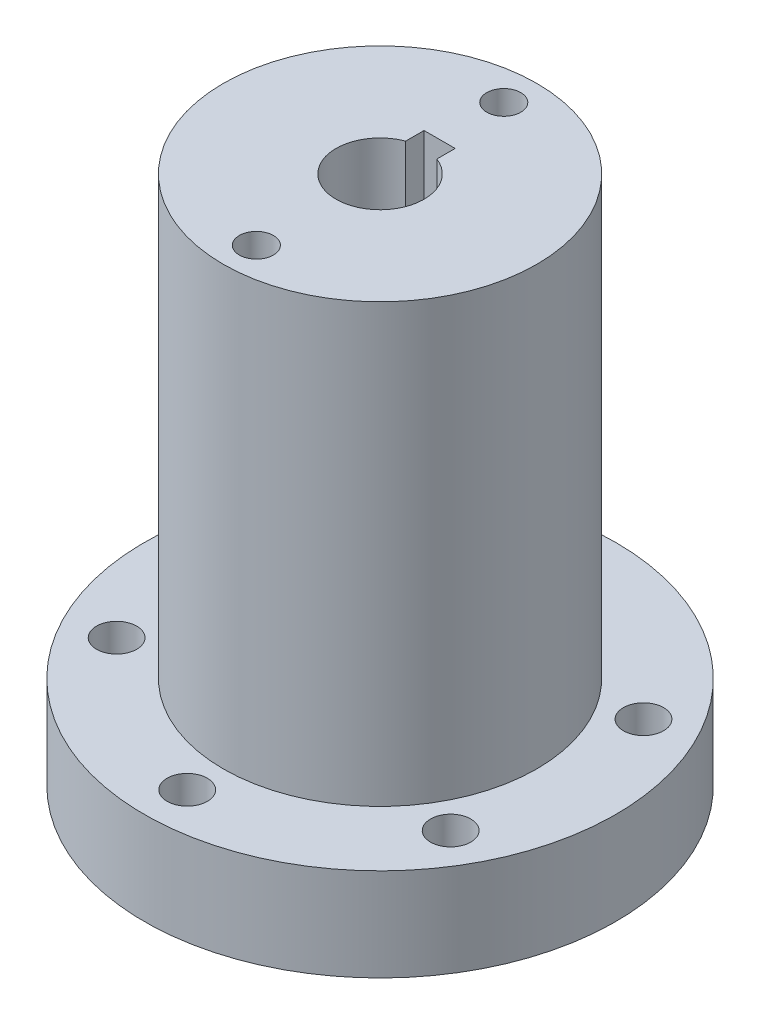
ISO-10303-21;
HEADER;
FILE_DESCRIPTION(('STEP AP214'),'2;1');
FILE_NAME('part.step','',(''),(''),'','','');
FILE_SCHEMA(('AUTOMOTIVE_DESIGN { 1 0 10303 214 1 1 1 1 }'));
ENDSEC;
DATA;
#1=APPLICATION_CONTEXT('core data for automotive mechanical design processes');
#2=APPLICATION_PROTOCOL_DEFINITION('international standard','automotive_design',2000,#1);
#3=PRODUCT_CONTEXT('',#1,'mechanical');
#4=PRODUCT('Part','Part','',(#3));
#5=PRODUCT_RELATED_PRODUCT_CATEGORY('part','',(#4));
#6=PRODUCT_DEFINITION_FORMATION('','',#4);
#7=PRODUCT_DEFINITION_CONTEXT('part definition',#1,'design');
#8=PRODUCT_DEFINITION('design','',#6,#7);
#9=PRODUCT_DEFINITION_SHAPE('','',#8);
#10=(LENGTH_UNIT() NAMED_UNIT(*) SI_UNIT(.MILLI.,.METRE.));
#11=(NAMED_UNIT(*) PLANE_ANGLE_UNIT() SI_UNIT($,.RADIAN.));
#12=(NAMED_UNIT(*) SI_UNIT($,.STERADIAN.) SOLID_ANGLE_UNIT());
#13=UNCERTAINTY_MEASURE_WITH_UNIT(LENGTH_MEASURE(1.E-05),#10,'distance_accuracy_value','');
#14=(GEOMETRIC_REPRESENTATION_CONTEXT(3) GLOBAL_UNCERTAINTY_ASSIGNED_CONTEXT((#13)) GLOBAL_UNIT_ASSIGNED_CONTEXT((#10,
#11,#12)) REPRESENTATION_CONTEXT('',''));
#15=CARTESIAN_POINT('',(0.,0.,0.));
#16=DIRECTION('',(0.,0.,1.));
#17=DIRECTION('',(1.,0.,0.));
#18=AXIS2_PLACEMENT_3D('',#15,#16,#17);
#19=CARTESIAN_POINT('',(0.,70.65,0.));
#20=DIRECTION('',(0.,1.,0.));
#21=DIRECTION('',(0.,0.,1.));
#22=AXIS2_PLACEMENT_3D('',#19,#20,#21);
#23=PLANE('',#22);
#24=CARTESIAN_POINT('',(0.,70.65,0.));
#25=DIRECTION('',(0.,1.,0.));
#26=DIRECTION('',(0.,0.,1.));
#27=AXIS2_PLACEMENT_3D('',#24,#25,#26);
#28=CIRCLE('',#27,25.34);
#29=CARTESIAN_POINT('',(0.,70.65,25.34));
#30=VERTEX_POINT('',#29);
#31=EDGE_CURVE('E137',#30,#30,#28,.T.);
#32=ORIENTED_EDGE('',*,*,#31,.T.);
#33=EDGE_LOOP('',(#32));
#34=FACE_BOUND('',#33,.T.);
#35=CARTESIAN_POINT('',(0.,70.65,-20.));
#36=DIRECTION('',(0.,1.,0.));
#37=DIRECTION('',(0.,0.,1.));
#38=AXIS2_PLACEMENT_3D('',#35,#36,#37);
#39=CIRCLE('',#38,2.75);
#40=CARTESIAN_POINT('',(0.,70.65,-17.25));
#41=VERTEX_POINT('',#40);
#42=EDGE_CURVE('E51',#41,#41,#39,.F.);
#43=ORIENTED_EDGE('',*,*,#42,.T.);
#44=EDGE_LOOP('',(#43));
#45=FACE_BOUND('',#44,.T.);
#46=CARTESIAN_POINT('',(0.,70.65,20.));
#47=DIRECTION('',(0.,1.,0.));
#48=DIRECTION('',(0.,0.,1.));
#49=AXIS2_PLACEMENT_3D('',#46,#47,#48);
#50=CIRCLE('',#49,2.75);
#51=CARTESIAN_POINT('',(0.,70.65,22.75));
#52=VERTEX_POINT('',#51);
#53=EDGE_CURVE('E145',#52,#52,#50,.F.);
#54=ORIENTED_EDGE('',*,*,#53,.T.);
#55=EDGE_LOOP('',(#54));
#56=FACE_BOUND('',#55,.T.);
#57=CARTESIAN_POINT('',(0.,70.65,0.));
#58=DIRECTION('',(0.,1.,0.));
#59=DIRECTION('',(0.,0.,1.));
#60=AXIS2_PLACEMENT_3D('',#57,#58,#59);
#61=CIRCLE('',#60,7.12);
#62=CARTESIAN_POINT('',(-2.51482759,70.65,-6.66108416044827));
#63=VERTEX_POINT('',#62);
#64=CARTESIAN_POINT('',(2.51482759,70.65,-6.66108416044827));
#65=VERTEX_POINT('',#64);
#66=EDGE_CURVE('E112',#63,#65,#61,.T.);
#67=ORIENTED_EDGE('',*,*,#66,.F.);
#68=DIRECTION('',(0.,0.,-1.));
#69=VECTOR('',#68,1.);
#70=CARTESIAN_POINT('',(-2.51482759,70.65,0.));
#71=LINE('',#70,#69);
#72=CARTESIAN_POINT('',(-2.51482759,70.65,-9.62638963));
#73=VERTEX_POINT('',#72);
#74=EDGE_CURVE('E65',#63,#73,#71,.T.);
#75=ORIENTED_EDGE('',*,*,#74,.T.);
#76=DIRECTION('',(1.,0.,0.));
#77=VECTOR('',#76,1.);
#78=CARTESIAN_POINT('',(0.,70.65,-9.62638963));
#79=LINE('',#78,#77);
#80=CARTESIAN_POINT('',(2.51482759,70.65,-9.62638963));
#81=VERTEX_POINT('',#80);
#82=EDGE_CURVE('E91',#73,#81,#79,.T.);
#83=ORIENTED_EDGE('',*,*,#82,.T.);
#84=DIRECTION('',(0.,0.,1.));
#85=VECTOR('',#84,1.);
#86=CARTESIAN_POINT('',(2.51482759,70.65,0.));
#87=LINE('',#86,#85);
#88=EDGE_CURVE('E129',#81,#65,#87,.T.);
#89=ORIENTED_EDGE('',*,*,#88,.T.);
#90=EDGE_LOOP('',(#67,#75,#83,#89));
#91=FACE_BOUND('',#90,.T.);
#92=ADVANCED_FACE('F47',(#34,#45,#56,#91),#23,.T.);
#93=CARTESIAN_POINT('',(0.,8.5,0.));
#94=DIRECTION('',(0.,-1.,0.));
#95=DIRECTION('',(0.,0.,-1.));
#96=AXIS2_PLACEMENT_3D('',#93,#94,#95);
#97=CYLINDRICAL_SURFACE('',#96,25.34);
#98=CARTESIAN_POINT('',(0.,0.,0.));
#99=DIRECTION('',(0.,1.,0.));
#100=DIRECTION('',(0.,0.,1.));
#101=AXIS2_PLACEMENT_3D('',#98,#99,#100);
#102=CIRCLE('',#101,25.34);
#103=CARTESIAN_POINT('',(0.,0.,25.34));
#104=VERTEX_POINT('',#103);
#105=EDGE_CURVE('E11',#104,#104,#102,.T.);
#106=ORIENTED_EDGE('',*,*,#105,.T.);
#107=EDGE_LOOP('',(#106));
#108=FACE_BOUND('',#107,.T.);
#109=ORIENTED_EDGE('',*,*,#31,.F.);
#110=EDGE_LOOP('',(#109));
#111=FACE_BOUND('',#110,.T.);
#112=ADVANCED_FACE('F49',(#108,#111),#97,.T.);
#113=CARTESIAN_POINT('',(0.,-48.35,20.));
#114=DIRECTION('',(0.,1.,0.));
#115=DIRECTION('',(0.,0.,1.));
#116=AXIS2_PLACEMENT_3D('',#113,#114,#115);
#117=CYLINDRICAL_SURFACE('',#116,2.75);
#118=CARTESIAN_POINT('',(0.,-15.,20.));
#119=DIRECTION('',(0.,-1.,0.));
#120=DIRECTION('',(0.,0.,-1.));
#121=AXIS2_PLACEMENT_3D('',#118,#119,#120);
#122=CIRCLE('',#121,2.75);
#123=CARTESIAN_POINT('',(0.,-15.,17.25));
#124=VERTEX_POINT('',#123);
#125=EDGE_CURVE('E149',#124,#124,#122,.T.);
#126=ORIENTED_EDGE('',*,*,#125,.T.);
#127=EDGE_LOOP('',(#126));
#128=FACE_BOUND('',#127,.T.);
#129=ORIENTED_EDGE('',*,*,#53,.F.);
#130=EDGE_LOOP('',(#129));
#131=FACE_BOUND('',#130,.T.);
#132=ADVANCED_FACE('F249',(#128,#131),#117,.F.);
#133=CARTESIAN_POINT('',(0.,-48.35,-20.));
#134=DIRECTION('',(0.,1.,0.));
#135=DIRECTION('',(0.,0.,1.));
#136=AXIS2_PLACEMENT_3D('',#133,#134,#135);
#137=CYLINDRICAL_SURFACE('',#136,2.75);
#138=CARTESIAN_POINT('',(0.,-15.,-20.));
#139=DIRECTION('',(0.,-1.,0.));
#140=DIRECTION('',(0.,0.,-1.));
#141=AXIS2_PLACEMENT_3D('',#138,#139,#140);
#142=CIRCLE('',#141,2.75);
#143=CARTESIAN_POINT('',(0.,-15.,-22.75));
#144=VERTEX_POINT('',#143);
#145=EDGE_CURVE('E171',#144,#144,#142,.T.);
#146=ORIENTED_EDGE('',*,*,#145,.T.);
#147=EDGE_LOOP('',(#146));
#148=FACE_BOUND('',#147,.T.);
#149=ORIENTED_EDGE('',*,*,#42,.F.);
#150=EDGE_LOOP('',(#149));
#151=FACE_BOUND('',#150,.T.);
#152=ADVANCED_FACE('F212',(#148,#151),#137,.F.);
#153=CARTESIAN_POINT('',(0.,0.,0.));
#154=DIRECTION('',(0.,-1.,0.));
#155=DIRECTION('',(0.,0.,-1.));
#156=AXIS2_PLACEMENT_3D('',#153,#154,#155);
#157=PLANE('',#156);
#158=CARTESIAN_POINT('',(-27.,0.,15.5884572681199));
#159=DIRECTION('',(0.,1.,0.));
#160=DIRECTION('',(0.,0.,1.));
#161=AXIS2_PLACEMENT_3D('',#158,#159,#160);
#162=CIRCLE('',#161,3.25);
#163=CARTESIAN_POINT('',(-27.,0.,18.8384572681199));
#164=VERTEX_POINT('',#163);
#165=EDGE_CURVE('E167',#164,#164,#162,.T.);
#166=ORIENTED_EDGE('',*,*,#165,.F.);
#167=EDGE_LOOP('',(#166));
#168=FACE_BOUND('',#167,.T.);
#169=CARTESIAN_POINT('',(0.,0.,31.1769145362398));
#170=DIRECTION('',(0.,1.,0.));
#171=DIRECTION('',(0.,0.,1.));
#172=AXIS2_PLACEMENT_3D('',#169,#170,#171);
#173=CIRCLE('',#172,3.25);
#174=CARTESIAN_POINT('',(0.,0.,34.4269145362398));
#175=VERTEX_POINT('',#174);
#176=EDGE_CURVE('E163',#175,#175,#173,.T.);
#177=ORIENTED_EDGE('',*,*,#176,.F.);
#178=EDGE_LOOP('',(#177));
#179=FACE_BOUND('',#178,.T.);
#180=CARTESIAN_POINT('',(27.,0.,15.5884572681199));
#181=DIRECTION('',(0.,1.,0.));
#182=DIRECTION('',(0.,0.,1.));
#183=AXIS2_PLACEMENT_3D('',#180,#181,#182);
#184=CIRCLE('',#183,3.25);
#185=CARTESIAN_POINT('',(27.,0.,18.8384572681199));
#186=VERTEX_POINT('',#185);
#187=EDGE_CURVE('E159',#186,#186,#184,.T.);
#188=ORIENTED_EDGE('',*,*,#187,.F.);
#189=EDGE_LOOP('',(#188));
#190=FACE_BOUND('',#189,.T.);
#191=CARTESIAN_POINT('',(27.,0.,-15.5884572681199));
#192=DIRECTION('',(0.,1.,0.));
#193=DIRECTION('',(0.,0.,1.));
#194=AXIS2_PLACEMENT_3D('',#191,#192,#193);
#195=CIRCLE('',#194,3.25);
#196=CARTESIAN_POINT('',(27.,0.,-12.3384572681199));
#197=VERTEX_POINT('',#196);
#198=EDGE_CURVE('E155',#197,#197,#195,.T.);
#199=ORIENTED_EDGE('',*,*,#198,.F.);
#200=EDGE_LOOP('',(#199));
#201=FACE_BOUND('',#200,.T.);
#202=CARTESIAN_POINT('',(0.,0.,-31.1769145362398));
#203=DIRECTION('',(0.,1.,0.));
#204=DIRECTION('',(0.,0.,1.));
#205=AXIS2_PLACEMENT_3D('',#202,#203,#204);
#206=CIRCLE('',#205,3.25);
#207=CARTESIAN_POINT('',(0.,0.,-27.9269145362398));
#208=VERTEX_POINT('',#207);
#209=EDGE_CURVE('E150',#208,#208,#206,.T.);
#210=ORIENTED_EDGE('',*,*,#209,.F.);
#211=EDGE_LOOP('',(#210));
#212=FACE_BOUND('',#211,.T.);
#213=CARTESIAN_POINT('',(-27.,0.,-15.5884572681199));
#214=DIRECTION('',(0.,1.,0.));
#215=DIRECTION('',(0.,0.,1.));
#216=AXIS2_PLACEMENT_3D('',#213,#214,#215);
#217=CIRCLE('',#216,3.25);
#218=CARTESIAN_POINT('',(-27.,0.,-12.3384572681199));
#219=VERTEX_POINT('',#218);
#220=EDGE_CURVE('E154',#219,#219,#217,.T.);
#221=ORIENTED_EDGE('',*,*,#220,.F.);
#222=EDGE_LOOP('',(#221));
#223=FACE_BOUND('',#222,.T.);
#224=ORIENTED_EDGE('',*,*,#105,.F.);
#225=EDGE_LOOP('',(#224));
#226=FACE_BOUND('',#225,.T.);
#227=CARTESIAN_POINT('',(0.,0.,0.));
#228=DIRECTION('',(0.,-1.,0.));
#229=DIRECTION('',(0.,0.,-1.));
#230=AXIS2_PLACEMENT_3D('',#227,#228,#229);
#231=CIRCLE('',#230,38.1);
#232=CARTESIAN_POINT('',(0.,0.,-38.1));
#233=VERTEX_POINT('',#232);
#234=EDGE_CURVE('E179',#233,#233,#231,.T.);
#235=ORIENTED_EDGE('',*,*,#234,.F.);
#236=EDGE_LOOP('',(#235));
#237=FACE_BOUND('',#236,.T.);
#238=ADVANCED_FACE('F219',(#168,#179,#190,#201,#212,#223,#226,#237),#157,.F.);
#239=CARTESIAN_POINT('',(0.,-15.,0.));
#240=DIRECTION('',(0.,-1.,0.));
#241=DIRECTION('',(0.,0.,-1.));
#242=AXIS2_PLACEMENT_3D('',#239,#240,#241);
#243=PLANE('',#242);
#244=ORIENTED_EDGE('',*,*,#145,.F.);
#245=EDGE_LOOP('',(#244));
#246=FACE_BOUND('',#245,.T.);
#247=ORIENTED_EDGE('',*,*,#125,.F.);
#248=EDGE_LOOP('',(#247));
#249=FACE_BOUND('',#248,.T.);
#250=CARTESIAN_POINT('',(-27.,-15.,15.5884572681199));
#251=DIRECTION('',(0.,-1.,0.));
#252=DIRECTION('',(0.,0.,-1.));
#253=AXIS2_PLACEMENT_3D('',#250,#251,#252);
#254=CIRCLE('',#253,3.25);
#255=CARTESIAN_POINT('',(-27.,-15.,12.3384572681199));
#256=VERTEX_POINT('',#255);
#257=EDGE_CURVE('E182',#256,#256,#254,.T.);
#258=ORIENTED_EDGE('',*,*,#257,.F.);
#259=EDGE_LOOP('',(#258));
#260=FACE_BOUND('',#259,.T.);
#261=CARTESIAN_POINT('',(0.,-15.,31.1769145362398));
#262=DIRECTION('',(0.,-1.,0.));
#263=DIRECTION('',(0.,0.,-1.));
#264=AXIS2_PLACEMENT_3D('',#261,#262,#263);
#265=CIRCLE('',#264,3.25);
#266=CARTESIAN_POINT('',(0.,-15.,27.9269145362398));
#267=VERTEX_POINT('',#266);
#268=EDGE_CURVE('E199',#267,#267,#265,.T.);
#269=ORIENTED_EDGE('',*,*,#268,.F.);
#270=EDGE_LOOP('',(#269));
#271=FACE_BOUND('',#270,.T.);
#272=CARTESIAN_POINT('',(27.,-15.,15.5884572681199));
#273=DIRECTION('',(0.,-1.,0.));
#274=DIRECTION('',(0.,0.,-1.));
#275=AXIS2_PLACEMENT_3D('',#272,#273,#274);
#276=CIRCLE('',#275,3.25);
#277=CARTESIAN_POINT('',(27.,-15.,12.3384572681199));
#278=VERTEX_POINT('',#277);
#279=EDGE_CURVE('E195',#278,#278,#276,.T.);
#280=ORIENTED_EDGE('',*,*,#279,.F.);
#281=EDGE_LOOP('',(#280));
#282=FACE_BOUND('',#281,.T.);
#283=CARTESIAN_POINT('',(27.,-15.,-15.5884572681199));
#284=DIRECTION('',(0.,-1.,0.));
#285=DIRECTION('',(0.,0.,-1.));
#286=AXIS2_PLACEMENT_3D('',#283,#284,#285);
#287=CIRCLE('',#286,3.25);
#288=CARTESIAN_POINT('',(27.,-15.,-18.8384572681199));
#289=VERTEX_POINT('',#288);
#290=EDGE_CURVE('E191',#289,#289,#287,.T.);
#291=ORIENTED_EDGE('',*,*,#290,.F.);
#292=EDGE_LOOP('',(#291));
#293=FACE_BOUND('',#292,.T.);
#294=CARTESIAN_POINT('',(0.,-15.,-31.1769145362398));
#295=DIRECTION('',(0.,-1.,0.));
#296=DIRECTION('',(0.,0.,-1.));
#297=AXIS2_PLACEMENT_3D('',#294,#295,#296);
#298=CIRCLE('',#297,3.25);
#299=CARTESIAN_POINT('',(0.,-15.,-34.4269145362398));
#300=VERTEX_POINT('',#299);
#301=EDGE_CURVE('E187',#300,#300,#298,.T.);
#302=ORIENTED_EDGE('',*,*,#301,.F.);
#303=EDGE_LOOP('',(#302));
#304=FACE_BOUND('',#303,.T.);
#305=CARTESIAN_POINT('',(-27.,-15.,-15.5884572681199));
#306=DIRECTION('',(0.,-1.,0.));
#307=DIRECTION('',(0.,0.,-1.));
#308=AXIS2_PLACEMENT_3D('',#305,#306,#307);
#309=CIRCLE('',#308,3.25);
#310=CARTESIAN_POINT('',(-27.,-15.,-18.8384572681199));
#311=VERTEX_POINT('',#310);
#312=EDGE_CURVE('E175',#311,#311,#309,.T.);
#313=ORIENTED_EDGE('',*,*,#312,.F.);
#314=EDGE_LOOP('',(#313));
#315=FACE_BOUND('',#314,.T.);
#316=CARTESIAN_POINT('',(0.,-15.,0.));
#317=DIRECTION('',(0.,-1.,0.));
#318=DIRECTION('',(0.,0.,-1.));
#319=AXIS2_PLACEMENT_3D('',#316,#317,#318);
#320=CIRCLE('',#319,38.1);
#321=CARTESIAN_POINT('',(0.,-15.,-38.1));
#322=VERTEX_POINT('',#321);
#323=EDGE_CURVE('E57',#322,#322,#320,.T.);
#324=ORIENTED_EDGE('',*,*,#323,.T.);
#325=EDGE_LOOP('',(#324));
#326=FACE_BOUND('',#325,.T.);
#327=ADVANCED_FACE('F215',(#246,#249,#260,#271,#282,#293,#304,#315,#326),#243,.T.);
#328=CARTESIAN_POINT('',(0.,-15.,0.));
#329=DIRECTION('',(0.,1.,0.));
#330=DIRECTION('',(0.,0.,1.));
#331=AXIS2_PLACEMENT_3D('',#328,#329,#330);
#332=CYLINDRICAL_SURFACE('',#331,38.1);
#333=ORIENTED_EDGE('',*,*,#323,.F.);
#334=EDGE_LOOP('',(#333));
#335=FACE_BOUND('',#334,.T.);
#336=ORIENTED_EDGE('',*,*,#234,.T.);
#337=EDGE_LOOP('',(#336));
#338=FACE_BOUND('',#337,.T.);
#339=ADVANCED_FACE('F218',(#335,#338),#332,.T.);
#340=CARTESIAN_POINT('',(-27.,-20.,-15.5884572681199));
#341=DIRECTION('',(0.,1.,0.));
#342=DIRECTION('',(0.,0.,1.));
#343=AXIS2_PLACEMENT_3D('',#340,#341,#342);
#344=CYLINDRICAL_SURFACE('',#343,3.25);
#345=ORIENTED_EDGE('',*,*,#312,.T.);
#346=EDGE_LOOP('',(#345));
#347=FACE_BOUND('',#346,.T.);
#348=ORIENTED_EDGE('',*,*,#220,.T.);
#349=EDGE_LOOP('',(#348));
#350=FACE_BOUND('',#349,.T.);
#351=ADVANCED_FACE('F239',(#347,#350),#344,.F.);
#352=CARTESIAN_POINT('',(0.,-20.,-31.1769145362398));
#353=DIRECTION('',(0.,1.,0.));
#354=DIRECTION('',(0.,0.,1.));
#355=AXIS2_PLACEMENT_3D('',#352,#353,#354);
#356=CYLINDRICAL_SURFACE('',#355,3.25);
#357=ORIENTED_EDGE('',*,*,#301,.T.);
#358=EDGE_LOOP('',(#357));
#359=FACE_BOUND('',#358,.T.);
#360=ORIENTED_EDGE('',*,*,#209,.T.);
#361=EDGE_LOOP('',(#360));
#362=FACE_BOUND('',#361,.T.);
#363=ADVANCED_FACE('F269',(#359,#362),#356,.F.);
#364=CARTESIAN_POINT('',(27.,-20.,-15.5884572681199));
#365=DIRECTION('',(0.,1.,0.));
#366=DIRECTION('',(0.,0.,1.));
#367=AXIS2_PLACEMENT_3D('',#364,#365,#366);
#368=CYLINDRICAL_SURFACE('',#367,3.25);
#369=ORIENTED_EDGE('',*,*,#290,.T.);
#370=EDGE_LOOP('',(#369));
#371=FACE_BOUND('',#370,.T.);
#372=ORIENTED_EDGE('',*,*,#198,.T.);
#373=EDGE_LOOP('',(#372));
#374=FACE_BOUND('',#373,.T.);
#375=ADVANCED_FACE('F272',(#371,#374),#368,.F.);
#376=CARTESIAN_POINT('',(27.,-20.,15.5884572681199));
#377=DIRECTION('',(0.,1.,0.));
#378=DIRECTION('',(0.,0.,1.));
#379=AXIS2_PLACEMENT_3D('',#376,#377,#378);
#380=CYLINDRICAL_SURFACE('',#379,3.25);
#381=ORIENTED_EDGE('',*,*,#279,.T.);
#382=EDGE_LOOP('',(#381));
#383=FACE_BOUND('',#382,.T.);
#384=ORIENTED_EDGE('',*,*,#187,.T.);
#385=EDGE_LOOP('',(#384));
#386=FACE_BOUND('',#385,.T.);
#387=ADVANCED_FACE('F276',(#383,#386),#380,.F.);
#388=CARTESIAN_POINT('',(0.,-20.,31.1769145362398));
#389=DIRECTION('',(0.,1.,0.));
#390=DIRECTION('',(0.,0.,1.));
#391=AXIS2_PLACEMENT_3D('',#388,#389,#390);
#392=CYLINDRICAL_SURFACE('',#391,3.25);
#393=ORIENTED_EDGE('',*,*,#268,.T.);
#394=EDGE_LOOP('',(#393));
#395=FACE_BOUND('',#394,.T.);
#396=ORIENTED_EDGE('',*,*,#176,.T.);
#397=EDGE_LOOP('',(#396));
#398=FACE_BOUND('',#397,.T.);
#399=ADVANCED_FACE('F280',(#395,#398),#392,.F.);
#400=CARTESIAN_POINT('',(-27.,-20.,15.5884572681199));
#401=DIRECTION('',(0.,1.,0.));
#402=DIRECTION('',(0.,0.,1.));
#403=AXIS2_PLACEMENT_3D('',#400,#401,#402);
#404=CYLINDRICAL_SURFACE('',#403,3.25);
#405=ORIENTED_EDGE('',*,*,#257,.T.);
#406=EDGE_LOOP('',(#405));
#407=FACE_BOUND('',#406,.T.);
#408=ORIENTED_EDGE('',*,*,#165,.T.);
#409=EDGE_LOOP('',(#408));
#410=FACE_BOUND('',#409,.T.);
#411=ADVANCED_FACE('F284',(#407,#410),#404,.F.);
#412=CARTESIAN_POINT('',(-2.51482759,30.65,0.));
#413=DIRECTION('',(1.,0.,0.));
#414=DIRECTION('',(0.,0.,-1.));
#415=AXIS2_PLACEMENT_3D('',#412,#413,#414);
#416=PLANE('',#415);
#417=ORIENTED_EDGE('',*,*,#74,.F.);
#418=DIRECTION('',(0.,1.,0.));
#419=VECTOR('',#418,1.);
#420=CARTESIAN_POINT('',(-2.51482759,30.65,-6.66108416044827));
#421=LINE('',#420,#419);
#422=CARTESIAN_POINT('',(-2.51482759,30.65,-6.66108416044827));
#423=VERTEX_POINT('',#422);
#424=EDGE_CURVE('E93',#423,#63,#421,.T.);
#425=ORIENTED_EDGE('',*,*,#424,.F.);
#426=DIRECTION('',(0.,0.,-1.));
#427=VECTOR('',#426,1.);
#428=CARTESIAN_POINT('',(-2.51482759,30.65,0.));
#429=LINE('',#428,#427);
#430=CARTESIAN_POINT('',(-2.51482759,30.65,-9.62638963));
#431=VERTEX_POINT('',#430);
#432=EDGE_CURVE('E117',#423,#431,#429,.T.);
#433=ORIENTED_EDGE('',*,*,#432,.T.);
#434=DIRECTION('',(0.,1.,0.));
#435=VECTOR('',#434,1.);
#436=CARTESIAN_POINT('',(-2.51482759,30.65,-9.62638963));
#437=LINE('',#436,#435);
#438=EDGE_CURVE('E134',#431,#73,#437,.T.);
#439=ORIENTED_EDGE('',*,*,#438,.T.);
#440=EDGE_LOOP('',(#417,#425,#433,#439));
#441=FACE_BOUND('',#440,.T.);
#442=ADVANCED_FACE('F263',(#441),#416,.T.);
#443=CARTESIAN_POINT('',(0.,30.65,-9.62638963));
#444=DIRECTION('',(0.,0.,1.));
#445=DIRECTION('',(1.,0.,0.));
#446=AXIS2_PLACEMENT_3D('',#443,#444,#445);
#447=PLANE('',#446);
#448=ORIENTED_EDGE('',*,*,#82,.F.);
#449=ORIENTED_EDGE('',*,*,#438,.F.);
#450=DIRECTION('',(1.,0.,0.));
#451=VECTOR('',#450,1.);
#452=CARTESIAN_POINT('',(0.,30.65,-9.62638963));
#453=LINE('',#452,#451);
#454=CARTESIAN_POINT('',(2.51482759,30.65,-9.62638963));
#455=VERTEX_POINT('',#454);
#456=EDGE_CURVE('E74',#431,#455,#453,.T.);
#457=ORIENTED_EDGE('',*,*,#456,.T.);
#458=DIRECTION('',(0.,1.,0.));
#459=VECTOR('',#458,1.);
#460=CARTESIAN_POINT('',(2.51482759,30.65,-9.62638963));
#461=LINE('',#460,#459);
#462=EDGE_CURVE('E103',#455,#81,#461,.T.);
#463=ORIENTED_EDGE('',*,*,#462,.T.);
#464=EDGE_LOOP('',(#448,#449,#457,#463));
#465=FACE_BOUND('',#464,.T.);
#466=ADVANCED_FACE('F382',(#465),#447,.T.);
#467=CARTESIAN_POINT('',(2.51482759,30.65,0.));
#468=DIRECTION('',(-1.,0.,0.));
#469=DIRECTION('',(0.,0.,1.));
#470=AXIS2_PLACEMENT_3D('',#467,#468,#469);
#471=PLANE('',#470);
#472=ORIENTED_EDGE('',*,*,#88,.F.);
#473=ORIENTED_EDGE('',*,*,#462,.F.);
#474=DIRECTION('',(0.,0.,1.));
#475=VECTOR('',#474,1.);
#476=CARTESIAN_POINT('',(2.51482759,30.65,0.));
#477=LINE('',#476,#475);
#478=CARTESIAN_POINT('',(2.51482759,30.65,-6.66108416044827));
#479=VERTEX_POINT('',#478);
#480=EDGE_CURVE('E97',#455,#479,#477,.T.);
#481=ORIENTED_EDGE('',*,*,#480,.T.);
#482=DIRECTION('',(0.,1.,0.));
#483=VECTOR('',#482,1.);
#484=CARTESIAN_POINT('',(2.51482759,30.65,-6.66108416044827));
#485=LINE('',#484,#483);
#486=EDGE_CURVE('E101',#479,#65,#485,.T.);
#487=ORIENTED_EDGE('',*,*,#486,.T.);
#488=EDGE_LOOP('',(#472,#473,#481,#487));
#489=FACE_BOUND('',#488,.T.);
#490=ADVANCED_FACE('F100',(#489),#471,.T.);
#491=CARTESIAN_POINT('',(0.,30.65,0.));
#492=DIRECTION('',(0.,1.,0.));
#493=DIRECTION('',(0.,0.,1.));
#494=AXIS2_PLACEMENT_3D('',#491,#492,#493);
#495=CYLINDRICAL_SURFACE('',#494,7.12);
#496=ORIENTED_EDGE('',*,*,#66,.T.);
#497=ORIENTED_EDGE('',*,*,#486,.F.);
#498=CARTESIAN_POINT('',(0.,30.65,0.));
#499=DIRECTION('',(0.,1.,0.));
#500=DIRECTION('',(0.,0.,1.));
#501=AXIS2_PLACEMENT_3D('',#498,#499,#500);
#502=CIRCLE('',#501,7.12);
#503=EDGE_CURVE('E106',#423,#479,#502,.T.);
#504=ORIENTED_EDGE('',*,*,#503,.F.);
#505=ORIENTED_EDGE('',*,*,#424,.T.);
#506=EDGE_LOOP('',(#496,#497,#504,#505));
#507=FACE_BOUND('',#506,.T.);
#508=ADVANCED_FACE('F110',(#507),#495,.F.);
#509=CARTESIAN_POINT('',(0.,30.65,0.));
#510=DIRECTION('',(0.,1.,0.));
#511=DIRECTION('',(0.,0.,1.));
#512=AXIS2_PLACEMENT_3D('',#509,#510,#511);
#513=PLANE('',#512);
#514=ORIENTED_EDGE('',*,*,#432,.F.);
#515=ORIENTED_EDGE('',*,*,#503,.T.);
#516=ORIENTED_EDGE('',*,*,#480,.F.);
#517=ORIENTED_EDGE('',*,*,#456,.F.);
#518=EDGE_LOOP('',(#514,#515,#516,#517));
#519=FACE_BOUND('',#518,.T.);
#520=ADVANCED_FACE('F116',(#519),#513,.T.);
#521=CLOSED_SHELL('',(#92,#112,#132,#152,#238,#327,#339,#351,#363,#375,#387,#399,#411,#442,#466,
#490,#508,#520));
#522=MANIFOLD_SOLID_BREP('B2',#521);
#523=ADVANCED_BREP_SHAPE_REPRESENTATION('',(#18,#522),#14);
#524=SHAPE_DEFINITION_REPRESENTATION(#9,#523);
ENDSEC;
END-ISO-10303-21;
